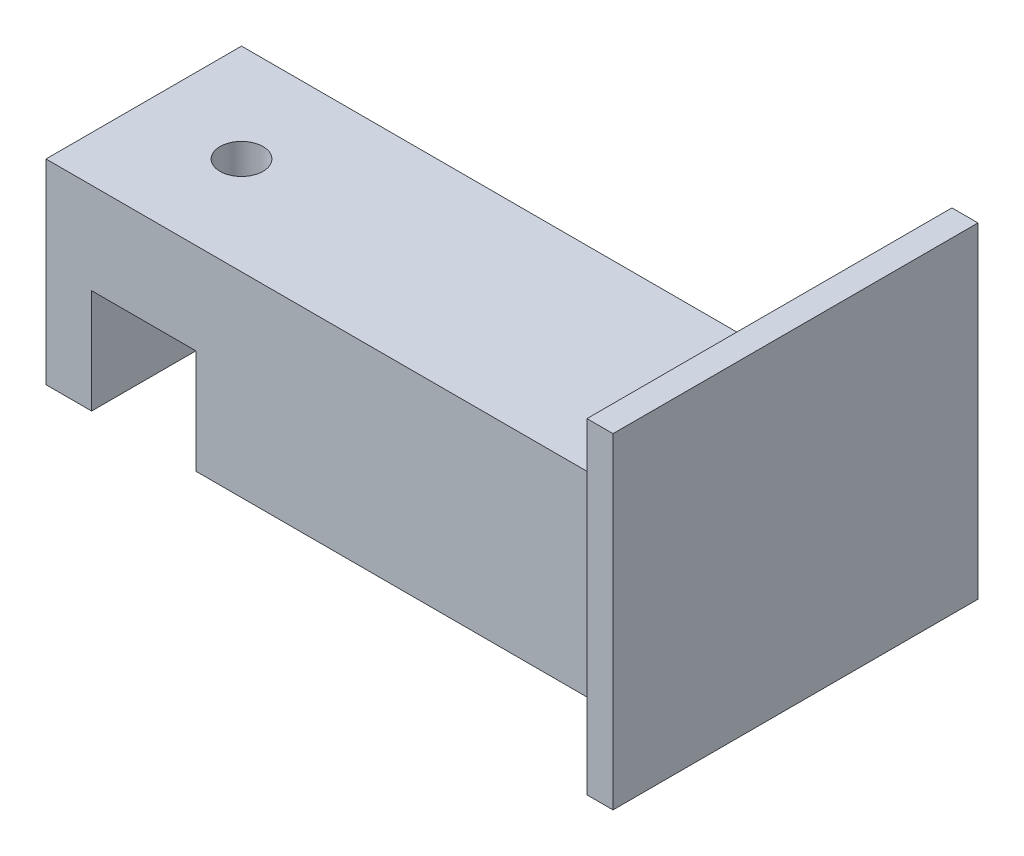
ISO-10303-21;
HEADER;
FILE_DESCRIPTION(('STEP AP214'),'2;1');
FILE_NAME('part.step','',(''),(''),'','','');
FILE_SCHEMA(('AUTOMOTIVE_DESIGN { 1 0 10303 214 1 1 1 1 }'));
ENDSEC;
DATA;
#1=APPLICATION_CONTEXT('core data for automotive mechanical design processes');
#2=APPLICATION_PROTOCOL_DEFINITION('international standard','automotive_design',2000,#1);
#3=PRODUCT_CONTEXT('',#1,'mechanical');
#4=PRODUCT('Part','Part','',(#3));
#5=PRODUCT_RELATED_PRODUCT_CATEGORY('part','',(#4));
#6=PRODUCT_DEFINITION_FORMATION('','',#4);
#7=PRODUCT_DEFINITION_CONTEXT('part definition',#1,'design');
#8=PRODUCT_DEFINITION('design','',#6,#7);
#9=PRODUCT_DEFINITION_SHAPE('','',#8);
#10=(LENGTH_UNIT() NAMED_UNIT(*) SI_UNIT(.MILLI.,.METRE.));
#11=(NAMED_UNIT(*) PLANE_ANGLE_UNIT() SI_UNIT($,.RADIAN.));
#12=(NAMED_UNIT(*) SI_UNIT($,.STERADIAN.) SOLID_ANGLE_UNIT());
#13=UNCERTAINTY_MEASURE_WITH_UNIT(LENGTH_MEASURE(1.E-05),#10,'distance_accuracy_value','');
#14=(GEOMETRIC_REPRESENTATION_CONTEXT(3) GLOBAL_UNCERTAINTY_ASSIGNED_CONTEXT((#13)) GLOBAL_UNIT_ASSIGNED_CONTEXT((#10,
#11,#12)) REPRESENTATION_CONTEXT('',''));
#15=CARTESIAN_POINT('',(0.,0.,0.));
#16=DIRECTION('',(0.,0.,1.));
#17=DIRECTION('',(1.,0.,0.));
#18=AXIS2_PLACEMENT_3D('',#15,#16,#17);
#19=CARTESIAN_POINT('',(0.,-15.,0.));
#20=DIRECTION('',(0.,-1.,0.));
#21=DIRECTION('',(0.,0.,-1.));
#22=AXIS2_PLACEMENT_3D('',#19,#20,#21);
#23=PLANE('',#22);
#24=DIRECTION('',(-1.,0.,0.));
#25=VECTOR('',#24,1.);
#26=CARTESIAN_POINT('',(-7.5,-15.,-7.5));
#27=LINE('',#26,#25);
#28=CARTESIAN_POINT('',(40.5,-15.,-7.49999999999999));
#29=VERTEX_POINT('',#28);
#30=CARTESIAN_POINT('',(4.,-15.,-7.5));
#31=VERTEX_POINT('',#30);
#32=EDGE_CURVE('E112',#29,#31,#27,.T.);
#33=ORIENTED_EDGE('',*,*,#32,.F.);
#34=DIRECTION('',(0.,0.,-1.));
#35=VECTOR('',#34,1.);
#36=CARTESIAN_POINT('',(40.5,-15.,14.));
#37=LINE('',#36,#35);
#38=CARTESIAN_POINT('',(40.5,-15.,-14.));
#39=VERTEX_POINT('',#38);
#40=EDGE_CURVE('E268',#29,#39,#37,.T.);
#41=ORIENTED_EDGE('',*,*,#40,.T.);
#42=DIRECTION('',(1.,0.,0.));
#43=VECTOR('',#42,1.);
#44=CARTESIAN_POINT('',(40.5,-15.,-14.));
#45=LINE('',#44,#43);
#46=CARTESIAN_POINT('',(42.5,-15.,-14.));
#47=VERTEX_POINT('',#46);
#48=EDGE_CURVE('E289',#39,#47,#45,.T.);
#49=ORIENTED_EDGE('',*,*,#48,.T.);
#50=DIRECTION('',(0.,0.,-1.));
#51=VECTOR('',#50,1.);
#52=CARTESIAN_POINT('',(42.5,-15.,7.5));
#53=LINE('',#52,#51);
#54=CARTESIAN_POINT('',(42.5,-15.,14.));
#55=VERTEX_POINT('',#54);
#56=EDGE_CURVE('E131',#55,#47,#53,.T.);
#57=ORIENTED_EDGE('',*,*,#56,.F.);
#58=DIRECTION('',(1.,0.,0.));
#59=VECTOR('',#58,1.);
#60=CARTESIAN_POINT('',(40.5,-15.,14.));
#61=LINE('',#60,#59);
#62=CARTESIAN_POINT('',(40.5,-15.,14.));
#63=VERTEX_POINT('',#62);
#64=EDGE_CURVE('E258',#63,#55,#61,.T.);
#65=ORIENTED_EDGE('',*,*,#64,.F.);
#66=CARTESIAN_POINT('',(40.5,-15.,7.5));
#67=VERTEX_POINT('',#66);
#68=EDGE_CURVE('E199',#63,#67,#37,.T.);
#69=ORIENTED_EDGE('',*,*,#68,.T.);
#70=DIRECTION('',(1.,0.,0.));
#71=VECTOR('',#70,1.);
#72=CARTESIAN_POINT('',(-7.5,-15.,7.5));
#73=LINE('',#72,#71);
#74=CARTESIAN_POINT('',(4.,-15.,7.5));
#75=VERTEX_POINT('',#74);
#76=EDGE_CURVE('E180',#75,#67,#73,.T.);
#77=ORIENTED_EDGE('',*,*,#76,.F.);
#78=DIRECTION('',(0.,0.,1.));
#79=VECTOR('',#78,1.);
#80=CARTESIAN_POINT('',(4.,-15.,0.));
#81=LINE('',#80,#79);
#82=EDGE_CURVE('E121',#31,#75,#81,.T.);
#83=ORIENTED_EDGE('',*,*,#82,.F.);
#84=EDGE_LOOP('',(#33,#41,#49,#57,#65,#69,#77,#83));
#85=FACE_BOUND('',#84,.T.);
#86=ADVANCED_FACE('F45',(#85),#23,.T.);
#87=CARTESIAN_POINT('',(-7.5,-15.,7.5));
#88=DIRECTION('',(0.,0.,1.));
#89=DIRECTION('',(1.,0.,0.));
#90=AXIS2_PLACEMENT_3D('',#87,#88,#89);
#91=PLANE('',#90);
#92=DIRECTION('',(0.,-1.,0.));
#93=VECTOR('',#92,1.);
#94=CARTESIAN_POINT('',(40.5,-15.,7.5));
#95=LINE('',#94,#93);
#96=CARTESIAN_POINT('',(40.5,0.,7.5));
#97=VERTEX_POINT('',#96);
#98=EDGE_CURVE('E107',#97,#67,#95,.T.);
#99=ORIENTED_EDGE('',*,*,#98,.F.);
#100=DIRECTION('',(1.,0.,0.));
#101=VECTOR('',#100,1.);
#102=CARTESIAN_POINT('',(-7.5,0.,7.5));
#103=LINE('',#102,#101);
#104=CARTESIAN_POINT('',(-7.5,0.,7.5));
#105=VERTEX_POINT('',#104);
#106=EDGE_CURVE('E97',#105,#97,#103,.T.);
#107=ORIENTED_EDGE('',*,*,#106,.F.);
#108=DIRECTION('',(0.,1.,0.));
#109=VECTOR('',#108,1.);
#110=CARTESIAN_POINT('',(-7.5,-15.,7.5));
#111=LINE('',#110,#109);
#112=CARTESIAN_POINT('',(-7.5,-15.,7.5));
#113=VERTEX_POINT('',#112);
#114=EDGE_CURVE('E70',#113,#105,#111,.T.);
#115=ORIENTED_EDGE('',*,*,#114,.F.);
#116=CARTESIAN_POINT('',(-4.,-15.,7.5));
#117=VERTEX_POINT('',#116);
#118=EDGE_CURVE('E118',#113,#117,#73,.T.);
#119=ORIENTED_EDGE('',*,*,#118,.T.);
#120=DIRECTION('',(0.,-1.,0.));
#121=VECTOR('',#120,1.);
#122=CARTESIAN_POINT('',(-4.,-15.,7.5));
#123=LINE('',#122,#121);
#124=CARTESIAN_POINT('',(-4.,-7.,7.5));
#125=VERTEX_POINT('',#124);
#126=EDGE_CURVE('E61',#125,#117,#123,.T.);
#127=ORIENTED_EDGE('',*,*,#126,.F.);
#128=DIRECTION('',(-1.,0.,0.));
#129=VECTOR('',#128,1.);
#130=CARTESIAN_POINT('',(-7.5,-7.,7.5));
#131=LINE('',#130,#129);
#132=CARTESIAN_POINT('',(4.,-7.,7.5));
#133=VERTEX_POINT('',#132);
#134=EDGE_CURVE('E172',#133,#125,#131,.T.);
#135=ORIENTED_EDGE('',*,*,#134,.F.);
#136=DIRECTION('',(0.,1.,0.));
#137=VECTOR('',#136,1.);
#138=CARTESIAN_POINT('',(4.,-15.,7.5));
#139=LINE('',#138,#137);
#140=EDGE_CURVE('E168',#75,#133,#139,.T.);
#141=ORIENTED_EDGE('',*,*,#140,.F.);
#142=ORIENTED_EDGE('',*,*,#76,.T.);
#143=EDGE_LOOP('',(#99,#107,#115,#119,#127,#135,#141,#142));
#144=FACE_BOUND('',#143,.T.);
#145=ADVANCED_FACE('F104',(#144),#91,.T.);
#146=CARTESIAN_POINT('',(-7.5,-15.,7.5));
#147=DIRECTION('',(-1.,0.,0.));
#148=DIRECTION('',(0.,0.,1.));
#149=AXIS2_PLACEMENT_3D('',#146,#147,#148);
#150=PLANE('',#149);
#151=DIRECTION('',(0.,0.,1.));
#152=VECTOR('',#151,1.);
#153=CARTESIAN_POINT('',(-7.5,0.,7.5));
#154=LINE('',#153,#152);
#155=CARTESIAN_POINT('',(-7.5,0.,-7.5));
#156=VERTEX_POINT('',#155);
#157=EDGE_CURVE('E85',#156,#105,#154,.T.);
#158=ORIENTED_EDGE('',*,*,#157,.F.);
#159=DIRECTION('',(0.,1.,0.));
#160=VECTOR('',#159,1.);
#161=CARTESIAN_POINT('',(-7.5,-15.,-7.5));
#162=LINE('',#161,#160);
#163=CARTESIAN_POINT('',(-7.5,-15.,-7.5));
#164=VERTEX_POINT('',#163);
#165=EDGE_CURVE('E91',#164,#156,#162,.T.);
#166=ORIENTED_EDGE('',*,*,#165,.F.);
#167=DIRECTION('',(0.,0.,1.));
#168=VECTOR('',#167,1.);
#169=CARTESIAN_POINT('',(-7.5,-15.,7.5));
#170=LINE('',#169,#168);
#171=EDGE_CURVE('E87',#164,#113,#170,.T.);
#172=ORIENTED_EDGE('',*,*,#171,.T.);
#173=ORIENTED_EDGE('',*,*,#114,.T.);
#174=EDGE_LOOP('',(#158,#166,#172,#173));
#175=FACE_BOUND('',#174,.T.);
#176=ADVANCED_FACE('F83',(#175),#150,.T.);
#177=CARTESIAN_POINT('',(-7.5,-15.,-7.5));
#178=DIRECTION('',(0.,0.,-1.));
#179=DIRECTION('',(-1.,0.,0.));
#180=AXIS2_PLACEMENT_3D('',#177,#178,#179);
#181=PLANE('',#180);
#182=DIRECTION('',(0.,1.,0.));
#183=VECTOR('',#182,1.);
#184=CARTESIAN_POINT('',(40.5,-15.,-7.5));
#185=LINE('',#184,#183);
#186=CARTESIAN_POINT('',(40.5,0.,-7.5));
#187=VERTEX_POINT('',#186);
#188=EDGE_CURVE('E148',#29,#187,#185,.T.);
#189=ORIENTED_EDGE('',*,*,#188,.F.);
#190=ORIENTED_EDGE('',*,*,#32,.T.);
#191=DIRECTION('',(0.,-1.,0.));
#192=VECTOR('',#191,1.);
#193=CARTESIAN_POINT('',(4.,-15.,-7.5));
#194=LINE('',#193,#192);
#195=CARTESIAN_POINT('',(4.,-7.,-7.5));
#196=VERTEX_POINT('',#195);
#197=EDGE_CURVE('E164',#196,#31,#194,.T.);
#198=ORIENTED_EDGE('',*,*,#197,.F.);
#199=DIRECTION('',(1.,0.,0.));
#200=VECTOR('',#199,1.);
#201=CARTESIAN_POINT('',(-7.5,-7.,-7.5));
#202=LINE('',#201,#200);
#203=CARTESIAN_POINT('',(-4.,-7.,-7.5));
#204=VERTEX_POINT('',#203);
#205=EDGE_CURVE('E54',#204,#196,#202,.T.);
#206=ORIENTED_EDGE('',*,*,#205,.F.);
#207=DIRECTION('',(0.,1.,0.));
#208=VECTOR('',#207,1.);
#209=CARTESIAN_POINT('',(-4.,-15.,-7.5));
#210=LINE('',#209,#208);
#211=CARTESIAN_POINT('',(-4.,-15.,-7.5));
#212=VERTEX_POINT('',#211);
#213=EDGE_CURVE('E156',#212,#204,#210,.T.);
#214=ORIENTED_EDGE('',*,*,#213,.F.);
#215=EDGE_CURVE('E109',#212,#164,#27,.T.);
#216=ORIENTED_EDGE('',*,*,#215,.T.);
#217=ORIENTED_EDGE('',*,*,#165,.T.);
#218=DIRECTION('',(-1.,0.,0.));
#219=VECTOR('',#218,1.);
#220=CARTESIAN_POINT('',(-7.5,0.,-7.5));
#221=LINE('',#220,#219);
#222=EDGE_CURVE('E99',#187,#156,#221,.T.);
#223=ORIENTED_EDGE('',*,*,#222,.F.);
#224=EDGE_LOOP('',(#189,#190,#198,#206,#214,#216,#217,#223));
#225=FACE_BOUND('',#224,.T.);
#226=ADVANCED_FACE('F47',(#225),#181,.T.);
#227=DIRECTION('',(0.,0.,-1.));
#228=VECTOR('',#227,1.);
#229=CARTESIAN_POINT('',(-4.,-15.,0.));
#230=LINE('',#229,#228);
#231=EDGE_CURVE('E90',#117,#212,#230,.T.);
#232=ORIENTED_EDGE('',*,*,#231,.F.);
#233=ORIENTED_EDGE('',*,*,#118,.F.);
#234=ORIENTED_EDGE('',*,*,#171,.F.);
#235=ORIENTED_EDGE('',*,*,#215,.F.);
#236=EDGE_LOOP('',(#232,#233,#234,#235));
#237=FACE_BOUND('',#236,.T.);
#238=ADVANCED_FACE('F299',(#237),#23,.T.);
#239=CARTESIAN_POINT('',(0.,0.,0.));
#240=DIRECTION('',(0.,-1.,0.));
#241=DIRECTION('',(0.,0.,-1.));
#242=AXIS2_PLACEMENT_3D('',#239,#240,#241);
#243=PLANE('',#242);
#244=CARTESIAN_POINT('',(0.,0.,0.));
#245=DIRECTION('',(0.,-1.,0.));
#246=DIRECTION('',(0.,0.,-1.));
#247=AXIS2_PLACEMENT_3D('',#244,#245,#246);
#248=CIRCLE('',#247,1.65);
#249=CARTESIAN_POINT('',(0.,0.,-1.65));
#250=VERTEX_POINT('',#249);
#251=EDGE_CURVE('E130',#250,#250,#248,.T.);
#252=ORIENTED_EDGE('',*,*,#251,.T.);
#253=EDGE_LOOP('',(#252));
#254=FACE_BOUND('',#253,.T.);
#255=ORIENTED_EDGE('',*,*,#106,.T.);
#256=DIRECTION('',(0.,0.,-1.));
#257=VECTOR('',#256,1.);
#258=CARTESIAN_POINT('',(40.5,0.,0.));
#259=LINE('',#258,#257);
#260=EDGE_CURVE('E11',#97,#187,#259,.T.);
#261=ORIENTED_EDGE('',*,*,#260,.T.);
#262=ORIENTED_EDGE('',*,*,#222,.T.);
#263=ORIENTED_EDGE('',*,*,#157,.T.);
#264=EDGE_LOOP('',(#255,#261,#262,#263));
#265=FACE_BOUND('',#264,.T.);
#266=ADVANCED_FACE('F95',(#254,#265),#243,.F.);
#267=CARTESIAN_POINT('',(-4.,-7.,-17.5));
#268=DIRECTION('',(0.,1.,0.));
#269=DIRECTION('',(0.,0.,1.));
#270=AXIS2_PLACEMENT_3D('',#267,#268,#269);
#271=PLANE('',#270);
#272=CARTESIAN_POINT('',(0.,-7.,0.));
#273=DIRECTION('',(0.,1.,0.));
#274=DIRECTION('',(0.,0.,1.));
#275=AXIS2_PLACEMENT_3D('',#272,#273,#274);
#276=CIRCLE('',#275,1.65);
#277=CARTESIAN_POINT('',(0.,-7.,1.65));
#278=VERTEX_POINT('',#277);
#279=EDGE_CURVE('E127',#278,#278,#276,.T.);
#280=ORIENTED_EDGE('',*,*,#279,.T.);
#281=EDGE_LOOP('',(#280));
#282=FACE_BOUND('',#281,.T.);
#283=ORIENTED_EDGE('',*,*,#134,.T.);
#284=DIRECTION('',(0.,0.,1.));
#285=VECTOR('',#284,1.);
#286=CARTESIAN_POINT('',(-4.,-7.,-17.5));
#287=LINE('',#286,#285);
#288=EDGE_CURVE('E137',#204,#125,#287,.T.);
#289=ORIENTED_EDGE('',*,*,#288,.F.);
#290=ORIENTED_EDGE('',*,*,#205,.T.);
#291=DIRECTION('',(0.,0.,1.));
#292=VECTOR('',#291,1.);
#293=CARTESIAN_POINT('',(4.,-7.,-17.5));
#294=LINE('',#293,#292);
#295=EDGE_CURVE('E152',#196,#133,#294,.T.);
#296=ORIENTED_EDGE('',*,*,#295,.T.);
#297=EDGE_LOOP('',(#283,#289,#290,#296));
#298=FACE_BOUND('',#297,.T.);
#299=ADVANCED_FACE('F211',(#282,#298),#271,.F.);
#300=CARTESIAN_POINT('',(4.,-7.,-17.5));
#301=DIRECTION('',(1.,0.,0.));
#302=DIRECTION('',(0.,1.,0.));
#303=AXIS2_PLACEMENT_3D('',#300,#301,#302);
#304=PLANE('',#303);
#305=ORIENTED_EDGE('',*,*,#140,.T.);
#306=ORIENTED_EDGE('',*,*,#295,.F.);
#307=ORIENTED_EDGE('',*,*,#197,.T.);
#308=ORIENTED_EDGE('',*,*,#82,.T.);
#309=EDGE_LOOP('',(#305,#306,#307,#308));
#310=FACE_BOUND('',#309,.T.);
#311=ADVANCED_FACE('F208',(#310),#304,.F.);
#312=CARTESIAN_POINT('',(-4.,-7.,-17.5));
#313=DIRECTION('',(-1.,0.,0.));
#314=DIRECTION('',(0.,-1.,0.));
#315=AXIS2_PLACEMENT_3D('',#312,#313,#314);
#316=PLANE('',#315);
#317=ORIENTED_EDGE('',*,*,#126,.T.);
#318=ORIENTED_EDGE('',*,*,#231,.T.);
#319=ORIENTED_EDGE('',*,*,#213,.T.);
#320=ORIENTED_EDGE('',*,*,#288,.T.);
#321=EDGE_LOOP('',(#317,#318,#319,#320));
#322=FACE_BOUND('',#321,.T.);
#323=ADVANCED_FACE('F300',(#322),#316,.F.);
#324=CARTESIAN_POINT('',(0.,-17.5,0.));
#325=DIRECTION('',(0.,1.,0.));
#326=DIRECTION('',(0.,0.,1.));
#327=AXIS2_PLACEMENT_3D('',#324,#325,#326);
#328=CYLINDRICAL_SURFACE('',#327,1.65);
#329=ORIENTED_EDGE('',*,*,#279,.F.);
#330=EDGE_LOOP('',(#329));
#331=FACE_BOUND('',#330,.T.);
#332=ORIENTED_EDGE('',*,*,#251,.F.);
#333=EDGE_LOOP('',(#332));
#334=FACE_BOUND('',#333,.T.);
#335=ADVANCED_FACE('F308',(#331,#334),#328,.F.);
#336=CARTESIAN_POINT('',(42.5,0.,0.));
#337=DIRECTION('',(1.,0.,0.));
#338=DIRECTION('',(0.,0.,-1.));
#339=AXIS2_PLACEMENT_3D('',#336,#337,#338);
#340=PLANE('',#339);
#341=DIRECTION('',(0.,-1.,0.));
#342=VECTOR('',#341,1.);
#343=CARTESIAN_POINT('',(42.5,10.,14.));
#344=LINE('',#343,#342);
#345=CARTESIAN_POINT('',(42.5,10.,14.));
#346=VERTEX_POINT('',#345);
#347=EDGE_CURVE('E252',#346,#55,#344,.T.);
#348=ORIENTED_EDGE('',*,*,#347,.T.);
#349=ORIENTED_EDGE('',*,*,#56,.T.);
#350=DIRECTION('',(0.,1.,0.));
#351=VECTOR('',#350,1.);
#352=CARTESIAN_POINT('',(42.5,10.,-14.));
#353=LINE('',#352,#351);
#354=CARTESIAN_POINT('',(42.5,10.,-14.));
#355=VERTEX_POINT('',#354);
#356=EDGE_CURVE('E273',#47,#355,#353,.T.);
#357=ORIENTED_EDGE('',*,*,#356,.T.);
#358=DIRECTION('',(0.,0.,1.));
#359=VECTOR('',#358,1.);
#360=CARTESIAN_POINT('',(42.5,10.,14.));
#361=LINE('',#360,#359);
#362=EDGE_CURVE('E282',#355,#346,#361,.T.);
#363=ORIENTED_EDGE('',*,*,#362,.T.);
#364=EDGE_LOOP('',(#348,#349,#357,#363));
#365=FACE_BOUND('',#364,.T.);
#366=ADVANCED_FACE('F306',(#365),#340,.T.);
#367=CARTESIAN_POINT('',(40.5,10.,14.));
#368=DIRECTION('',(0.,1.,0.));
#369=DIRECTION('',(0.,0.,1.));
#370=AXIS2_PLACEMENT_3D('',#367,#368,#369);
#371=PLANE('',#370);
#372=ORIENTED_EDGE('',*,*,#362,.F.);
#373=DIRECTION('',(1.,0.,0.));
#374=VECTOR('',#373,1.);
#375=CARTESIAN_POINT('',(40.5,10.,-14.));
#376=LINE('',#375,#374);
#377=CARTESIAN_POINT('',(40.5,10.,-14.));
#378=VERTEX_POINT('',#377);
#379=EDGE_CURVE('E271',#378,#355,#376,.T.);
#380=ORIENTED_EDGE('',*,*,#379,.F.);
#381=DIRECTION('',(0.,0.,1.));
#382=VECTOR('',#381,1.);
#383=CARTESIAN_POINT('',(40.5,10.,14.));
#384=LINE('',#383,#382);
#385=CARTESIAN_POINT('',(40.5,10.,14.));
#386=VERTEX_POINT('',#385);
#387=EDGE_CURVE('E265',#378,#386,#384,.T.);
#388=ORIENTED_EDGE('',*,*,#387,.T.);
#389=DIRECTION('',(1.,0.,0.));
#390=VECTOR('',#389,1.);
#391=CARTESIAN_POINT('',(40.5,10.,14.));
#392=LINE('',#391,#390);
#393=EDGE_CURVE('E247',#386,#346,#392,.T.);
#394=ORIENTED_EDGE('',*,*,#393,.T.);
#395=EDGE_LOOP('',(#372,#380,#388,#394));
#396=FACE_BOUND('',#395,.T.);
#397=ADVANCED_FACE('F270',(#396),#371,.T.);
#398=CARTESIAN_POINT('',(40.5,10.,-14.));
#399=DIRECTION('',(0.,0.,-1.));
#400=DIRECTION('',(0.,1.,0.));
#401=AXIS2_PLACEMENT_3D('',#398,#399,#400);
#402=PLANE('',#401);
#403=ORIENTED_EDGE('',*,*,#356,.F.);
#404=ORIENTED_EDGE('',*,*,#48,.F.);
#405=DIRECTION('',(0.,1.,0.));
#406=VECTOR('',#405,1.);
#407=CARTESIAN_POINT('',(40.5,10.,-14.));
#408=LINE('',#407,#406);
#409=EDGE_CURVE('E259',#39,#378,#408,.T.);
#410=ORIENTED_EDGE('',*,*,#409,.T.);
#411=ORIENTED_EDGE('',*,*,#379,.T.);
#412=EDGE_LOOP('',(#403,#404,#410,#411));
#413=FACE_BOUND('',#412,.T.);
#414=ADVANCED_FACE('F305',(#413),#402,.T.);
#415=CARTESIAN_POINT('',(40.5,10.,14.));
#416=DIRECTION('',(0.,0.,1.));
#417=DIRECTION('',(0.,-1.,0.));
#418=AXIS2_PLACEMENT_3D('',#415,#416,#417);
#419=PLANE('',#418);
#420=ORIENTED_EDGE('',*,*,#347,.F.);
#421=ORIENTED_EDGE('',*,*,#393,.F.);
#422=DIRECTION('',(0.,-1.,0.));
#423=VECTOR('',#422,1.);
#424=CARTESIAN_POINT('',(40.5,10.,14.));
#425=LINE('',#424,#423);
#426=EDGE_CURVE('E251',#386,#63,#425,.T.);
#427=ORIENTED_EDGE('',*,*,#426,.T.);
#428=ORIENTED_EDGE('',*,*,#64,.T.);
#429=EDGE_LOOP('',(#420,#421,#427,#428));
#430=FACE_BOUND('',#429,.T.);
#431=ADVANCED_FACE('F249',(#430),#419,.T.);
#432=CARTESIAN_POINT('',(40.5,0.,0.));
#433=DIRECTION('',(-1.,0.,0.));
#434=DIRECTION('',(0.,0.,1.));
#435=AXIS2_PLACEMENT_3D('',#432,#433,#434);
#436=PLANE('',#435);
#437=ORIENTED_EDGE('',*,*,#260,.F.);
#438=ORIENTED_EDGE('',*,*,#98,.T.);
#439=ORIENTED_EDGE('',*,*,#68,.F.);
#440=ORIENTED_EDGE('',*,*,#426,.F.);
#441=ORIENTED_EDGE('',*,*,#387,.F.);
#442=ORIENTED_EDGE('',*,*,#409,.F.);
#443=ORIENTED_EDGE('',*,*,#40,.F.);
#444=ORIENTED_EDGE('',*,*,#188,.T.);
#445=EDGE_LOOP('',(#437,#438,#439,#440,#441,#442,#443,#444));
#446=FACE_BOUND('',#445,.T.);
#447=ADVANCED_FACE('F263',(#446),#436,.T.);
#448=CLOSED_SHELL('',(#86,#145,#176,#226,#238,#266,#299,#311,#323,#335,#366,#397,#414,#431,#447));
#449=MANIFOLD_SOLID_BREP('B2',#448);
#450=ADVANCED_BREP_SHAPE_REPRESENTATION('',(#18,#449),#14);
#451=SHAPE_DEFINITION_REPRESENTATION(#9,#450);
ENDSEC;
END-ISO-10303-21;
